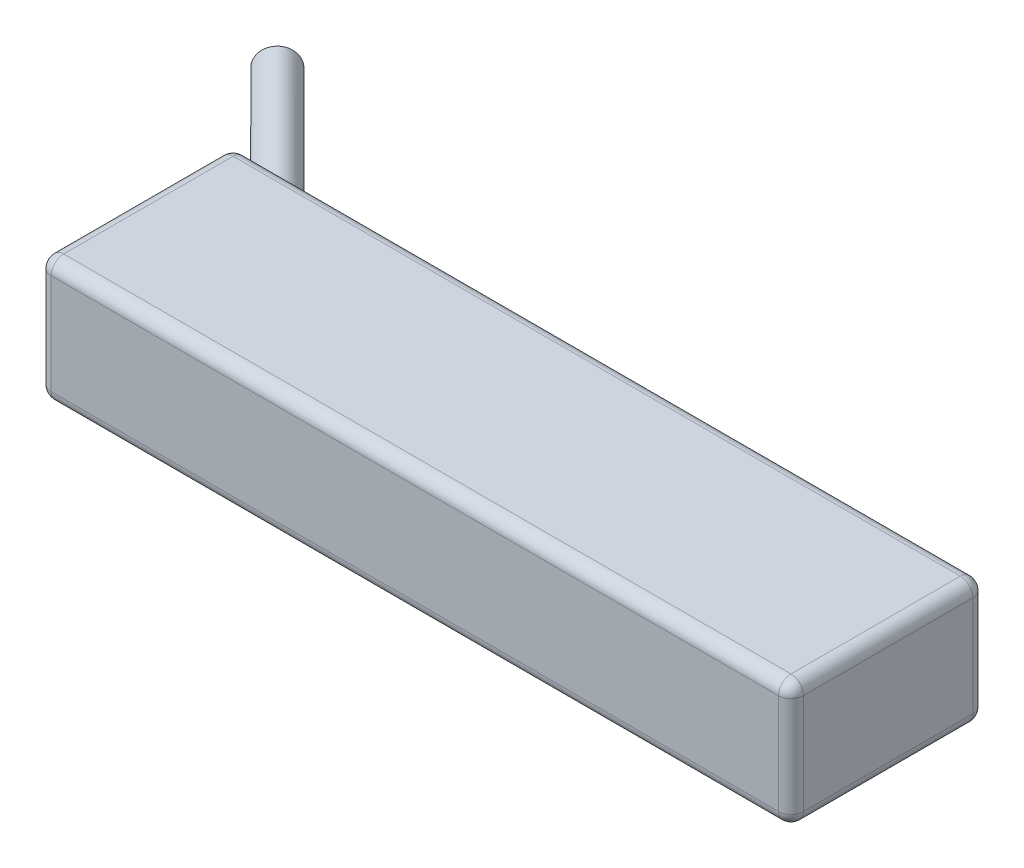
ISO-10303-21;
HEADER;
FILE_DESCRIPTION(('STEP AP214'),'2;1');
FILE_NAME('part.step','',(''),(''),'','','');
FILE_SCHEMA(('AUTOMOTIVE_DESIGN { 1 0 10303 214 1 1 1 1 }'));
ENDSEC;
DATA;
#1=APPLICATION_CONTEXT('core data for automotive mechanical design processes');
#2=APPLICATION_PROTOCOL_DEFINITION('international standard','automotive_design',2000,#1);
#3=PRODUCT_CONTEXT('',#1,'mechanical');
#4=PRODUCT('Part','Part','',(#3));
#5=PRODUCT_RELATED_PRODUCT_CATEGORY('part','',(#4));
#6=PRODUCT_DEFINITION_FORMATION('','',#4);
#7=PRODUCT_DEFINITION_CONTEXT('part definition',#1,'design');
#8=PRODUCT_DEFINITION('design','',#6,#7);
#9=PRODUCT_DEFINITION_SHAPE('','',#8);
#10=(LENGTH_UNIT() NAMED_UNIT(*) SI_UNIT(.MILLI.,.METRE.));
#11=(NAMED_UNIT(*) PLANE_ANGLE_UNIT() SI_UNIT($,.RADIAN.));
#12=(NAMED_UNIT(*) SI_UNIT($,.STERADIAN.) SOLID_ANGLE_UNIT());
#13=UNCERTAINTY_MEASURE_WITH_UNIT(LENGTH_MEASURE(1.E-05),#10,'distance_accuracy_value','');
#14=(GEOMETRIC_REPRESENTATION_CONTEXT(3) GLOBAL_UNCERTAINTY_ASSIGNED_CONTEXT((#13)) GLOBAL_UNIT_ASSIGNED_CONTEXT((#10,
#11,#12)) REPRESENTATION_CONTEXT('',''));
#15=CARTESIAN_POINT('',(0.,0.,0.));
#16=DIRECTION('',(0.,0.,1.));
#17=DIRECTION('',(1.,0.,0.));
#18=AXIS2_PLACEMENT_3D('',#15,#16,#17);
#19=CARTESIAN_POINT('',(60.,10.,-15.5));
#20=DIRECTION('',(-1.,0.,0.));
#21=DIRECTION('',(0.,0.,1.));
#22=AXIS2_PLACEMENT_3D('',#19,#20,#21);
#23=PLANE('',#22);
#24=DIRECTION('',(0.,-1.,0.));
#25=VECTOR('',#24,1.);
#26=CARTESIAN_POINT('',(60.,10.,13.5));
#27=LINE('',#26,#25);
#28=CARTESIAN_POINT('',(60.,8.,13.5));
#29=VERTEX_POINT('',#28);
#30=CARTESIAN_POINT('',(60.,-8.,13.5));
#31=VERTEX_POINT('',#30);
#32=EDGE_CURVE('E167',#29,#31,#27,.T.);
#33=ORIENTED_EDGE('',*,*,#32,.T.);
#34=DIRECTION('',(0.,0.,-1.));
#35=VECTOR('',#34,1.);
#36=CARTESIAN_POINT('',(60.,-8.,-15.5));
#37=LINE('',#36,#35);
#38=CARTESIAN_POINT('',(60.,-8.,-13.5));
#39=VERTEX_POINT('',#38);
#40=EDGE_CURVE('E172',#31,#39,#37,.T.);
#41=ORIENTED_EDGE('',*,*,#40,.T.);
#42=DIRECTION('',(0.,-1.,0.));
#43=VECTOR('',#42,1.);
#44=CARTESIAN_POINT('',(60.,10.,-13.5));
#45=LINE('',#44,#43);
#46=CARTESIAN_POINT('',(60.,8.,-13.5));
#47=VERTEX_POINT('',#46);
#48=EDGE_CURVE('E169',#39,#47,#45,.F.);
#49=ORIENTED_EDGE('',*,*,#48,.T.);
#50=DIRECTION('',(0.,0.,-1.));
#51=VECTOR('',#50,1.);
#52=CARTESIAN_POINT('',(60.,8.,15.5));
#53=LINE('',#52,#51);
#54=EDGE_CURVE('E165',#47,#29,#53,.F.);
#55=ORIENTED_EDGE('',*,*,#54,.T.);
#56=EDGE_LOOP('',(#33,#41,#49,#55));
#57=FACE_BOUND('',#56,.T.);
#58=ADVANCED_FACE('F38',(#57),#23,.F.);
#59=CARTESIAN_POINT('',(-60.,10.,-15.5));
#60=DIRECTION('',(0.,0.,1.));
#61=DIRECTION('',(1.,0.,0.));
#62=AXIS2_PLACEMENT_3D('',#59,#60,#61);
#63=PLANE('',#62);
#64=DIRECTION('',(0.,-1.,0.));
#65=VECTOR('',#64,1.);
#66=CARTESIAN_POINT('',(58.,10.,-15.5));
#67=LINE('',#66,#65);
#68=CARTESIAN_POINT('',(58.,8.,-15.5));
#69=VERTEX_POINT('',#68);
#70=CARTESIAN_POINT('',(58.,-8.,-15.5));
#71=VERTEX_POINT('',#70);
#72=EDGE_CURVE('E160',#69,#71,#67,.T.);
#73=ORIENTED_EDGE('',*,*,#72,.T.);
#74=DIRECTION('',(-1.,0.,0.));
#75=VECTOR('',#74,1.);
#76=CARTESIAN_POINT('',(-60.,-8.,-15.5));
#77=LINE('',#76,#75);
#78=CARTESIAN_POINT('',(-58.,-8.,-15.5));
#79=VERTEX_POINT('',#78);
#80=EDGE_CURVE('E163',#71,#79,#77,.T.);
#81=ORIENTED_EDGE('',*,*,#80,.T.);
#82=DIRECTION('',(0.,-1.,0.));
#83=VECTOR('',#82,1.);
#84=CARTESIAN_POINT('',(-58.,10.,-15.5));
#85=LINE('',#84,#83);
#86=CARTESIAN_POINT('',(-58.,8.,-15.5));
#87=VERTEX_POINT('',#86);
#88=EDGE_CURVE('E155',#79,#87,#85,.F.);
#89=ORIENTED_EDGE('',*,*,#88,.T.);
#90=DIRECTION('',(-1.,0.,0.));
#91=VECTOR('',#90,1.);
#92=CARTESIAN_POINT('',(60.,8.,-15.5));
#93=LINE('',#92,#91);
#94=EDGE_CURVE('E153',#87,#69,#93,.F.);
#95=ORIENTED_EDGE('',*,*,#94,.T.);
#96=EDGE_LOOP('',(#73,#81,#89,#95));
#97=FACE_BOUND('',#96,.T.);
#98=DIRECTION('',(0.,1.,0.));
#99=VECTOR('',#98,1.);
#100=CARTESIAN_POINT('',(-49.9999999999998,10.,-15.5));
#101=LINE('',#100,#99);
#102=CARTESIAN_POINT('',(-49.9999999999998,-6.17040966608935,-15.5));
#103=VERTEX_POINT('',#102);
#104=CARTESIAN_POINT('',(-49.9999999999998,-1.82959033391066,-15.5));
#105=VERTEX_POINT('',#104);
#106=EDGE_CURVE('E137',#103,#105,#101,.T.);
#107=ORIENTED_EDGE('',*,*,#106,.T.);
#108=CARTESIAN_POINT('',(-52.9289321881345,-4.,-15.5));
#109=DIRECTION('',(0.,0.,1.));
#110=DIRECTION('',(1.,0.,0.));
#111=AXIS2_PLACEMENT_3D('',#108,#109,#110);
#112=ELLIPSE('',#111,4.24264068711926,3.);
#113=EDGE_CURVE('E144',#105,#103,#112,.T.);
#114=ORIENTED_EDGE('',*,*,#113,.T.);
#115=EDGE_LOOP('',(#107,#114));
#116=FACE_BOUND('',#115,.T.);
#117=DIRECTION('',(0.,1.,0.));
#118=VECTOR('',#117,1.);
#119=CARTESIAN_POINT('',(-49.9999999999998,10.,-15.5));
#120=LINE('',#119,#118);
#121=CARTESIAN_POINT('',(-49.9999999999998,1.82959033391064,-15.5));
#122=VERTEX_POINT('',#121);
#123=CARTESIAN_POINT('',(-49.9999999999998,6.17040966608935,-15.5));
#124=VERTEX_POINT('',#123);
#125=EDGE_CURVE('E629',#122,#124,#120,.T.);
#126=ORIENTED_EDGE('',*,*,#125,.T.);
#127=CARTESIAN_POINT('',(-52.9289321881345,4.,-15.5));
#128=DIRECTION('',(0.,0.,1.));
#129=DIRECTION('',(1.,0.,0.));
#130=AXIS2_PLACEMENT_3D('',#127,#128,#129);
#131=ELLIPSE('',#130,4.24264068711927,3.);
#132=EDGE_CURVE('E145',#124,#122,#131,.T.);
#133=ORIENTED_EDGE('',*,*,#132,.T.);
#134=EDGE_LOOP('',(#126,#133));
#135=FACE_BOUND('',#134,.T.);
#136=ADVANCED_FACE('F151',(#97,#116,#135),#63,.F.);
#137=CARTESIAN_POINT('',(-60.,10.,-15.5));
#138=DIRECTION('',(1.,0.,0.));
#139=DIRECTION('',(0.,0.,-1.));
#140=AXIS2_PLACEMENT_3D('',#137,#138,#139);
#141=PLANE('',#140);
#142=DIRECTION('',(0.,-1.,0.));
#143=VECTOR('',#142,1.);
#144=CARTESIAN_POINT('',(-60.,10.,-13.5));
#145=LINE('',#144,#143);
#146=CARTESIAN_POINT('',(-60.,8.,-13.5));
#147=VERTEX_POINT('',#146);
#148=CARTESIAN_POINT('',(-60.,-8.,-13.5));
#149=VERTEX_POINT('',#148);
#150=EDGE_CURVE('E178',#147,#149,#145,.T.);
#151=ORIENTED_EDGE('',*,*,#150,.T.);
#152=DIRECTION('',(0.,0.,1.));
#153=VECTOR('',#152,1.);
#154=CARTESIAN_POINT('',(-60.,-8.,-15.5));
#155=LINE('',#154,#153);
#156=CARTESIAN_POINT('',(-60.,-8.,13.5));
#157=VERTEX_POINT('',#156);
#158=EDGE_CURVE('E181',#149,#157,#155,.T.);
#159=ORIENTED_EDGE('',*,*,#158,.T.);
#160=DIRECTION('',(0.,-1.,0.));
#161=VECTOR('',#160,1.);
#162=CARTESIAN_POINT('',(-60.,10.,13.5));
#163=LINE('',#162,#161);
#164=CARTESIAN_POINT('',(-60.,8.,13.5));
#165=VERTEX_POINT('',#164);
#166=EDGE_CURVE('E176',#157,#165,#163,.F.);
#167=ORIENTED_EDGE('',*,*,#166,.T.);
#168=DIRECTION('',(0.,0.,1.));
#169=VECTOR('',#168,1.);
#170=CARTESIAN_POINT('',(-60.,8.,-15.5));
#171=LINE('',#170,#169);
#172=EDGE_CURVE('E174',#165,#147,#171,.F.);
#173=ORIENTED_EDGE('',*,*,#172,.T.);
#174=EDGE_LOOP('',(#151,#159,#167,#173));
#175=FACE_BOUND('',#174,.T.);
#176=ADVANCED_FACE('F320',(#175),#141,.F.);
#177=CARTESIAN_POINT('',(-60.,10.,15.5));
#178=DIRECTION('',(0.,0.,-1.));
#179=DIRECTION('',(-1.,0.,0.));
#180=AXIS2_PLACEMENT_3D('',#177,#178,#179);
#181=PLANE('',#180);
#182=DIRECTION('',(0.,-1.,0.));
#183=VECTOR('',#182,1.);
#184=CARTESIAN_POINT('',(-58.,10.,15.5));
#185=LINE('',#184,#183);
#186=CARTESIAN_POINT('',(-58.,8.,15.5));
#187=VERTEX_POINT('',#186);
#188=CARTESIAN_POINT('',(-58.,-8.,15.5));
#189=VERTEX_POINT('',#188);
#190=EDGE_CURVE('E187',#187,#189,#185,.T.);
#191=ORIENTED_EDGE('',*,*,#190,.T.);
#192=DIRECTION('',(1.,0.,0.));
#193=VECTOR('',#192,1.);
#194=CARTESIAN_POINT('',(-60.,-8.,15.5));
#195=LINE('',#194,#193);
#196=CARTESIAN_POINT('',(58.,-8.,15.5));
#197=VERTEX_POINT('',#196);
#198=EDGE_CURVE('E190',#189,#197,#195,.T.);
#199=ORIENTED_EDGE('',*,*,#198,.T.);
#200=DIRECTION('',(0.,-1.,0.));
#201=VECTOR('',#200,1.);
#202=CARTESIAN_POINT('',(58.,10.,15.5));
#203=LINE('',#202,#201);
#204=CARTESIAN_POINT('',(58.,8.,15.5));
#205=VERTEX_POINT('',#204);
#206=EDGE_CURVE('E185',#197,#205,#203,.F.);
#207=ORIENTED_EDGE('',*,*,#206,.T.);
#208=DIRECTION('',(1.,0.,0.));
#209=VECTOR('',#208,1.);
#210=CARTESIAN_POINT('',(-60.,8.,15.5));
#211=LINE('',#210,#209);
#212=EDGE_CURVE('E183',#205,#187,#211,.F.);
#213=ORIENTED_EDGE('',*,*,#212,.T.);
#214=EDGE_LOOP('',(#191,#199,#207,#213));
#215=FACE_BOUND('',#214,.T.);
#216=ADVANCED_FACE('F323',(#215),#181,.F.);
#217=CARTESIAN_POINT('',(0.,10.,0.));
#218=DIRECTION('',(0.,1.,0.));
#219=DIRECTION('',(0.,0.,1.));
#220=AXIS2_PLACEMENT_3D('',#217,#218,#219);
#221=PLANE('',#220);
#222=DIRECTION('',(0.,0.,1.));
#223=VECTOR('',#222,1.);
#224=CARTESIAN_POINT('',(-58.,10.,15.5));
#225=LINE('',#224,#223);
#226=CARTESIAN_POINT('',(-58.,10.,-13.5));
#227=VERTEX_POINT('',#226);
#228=CARTESIAN_POINT('',(-58.,10.,13.5));
#229=VERTEX_POINT('',#228);
#230=EDGE_CURVE('E47',#227,#229,#225,.T.);
#231=ORIENTED_EDGE('',*,*,#230,.T.);
#232=DIRECTION('',(1.,0.,0.));
#233=VECTOR('',#232,1.);
#234=CARTESIAN_POINT('',(60.,10.,13.5));
#235=LINE('',#234,#233);
#236=CARTESIAN_POINT('',(58.,10.,13.5));
#237=VERTEX_POINT('',#236);
#238=EDGE_CURVE('E11',#229,#237,#235,.T.);
#239=ORIENTED_EDGE('',*,*,#238,.T.);
#240=DIRECTION('',(0.,0.,-1.));
#241=VECTOR('',#240,1.);
#242=CARTESIAN_POINT('',(58.,10.,-15.5));
#243=LINE('',#242,#241);
#244=CARTESIAN_POINT('',(58.,10.,-13.5));
#245=VERTEX_POINT('',#244);
#246=EDGE_CURVE('E201',#237,#245,#243,.T.);
#247=ORIENTED_EDGE('',*,*,#246,.T.);
#248=DIRECTION('',(-1.,0.,0.));
#249=VECTOR('',#248,1.);
#250=CARTESIAN_POINT('',(-60.,10.,-13.5));
#251=LINE('',#250,#249);
#252=EDGE_CURVE('E58',#245,#227,#251,.T.);
#253=ORIENTED_EDGE('',*,*,#252,.T.);
#254=EDGE_LOOP('',(#231,#239,#247,#253));
#255=FACE_BOUND('',#254,.T.);
#256=ADVANCED_FACE('F287',(#255),#221,.T.);
#257=CARTESIAN_POINT('',(0.,-10.,0.));
#258=DIRECTION('',(0.,1.,0.));
#259=DIRECTION('',(0.,0.,1.));
#260=AXIS2_PLACEMENT_3D('',#257,#258,#259);
#261=PLANE('',#260);
#262=DIRECTION('',(0.,0.,1.));
#263=VECTOR('',#262,1.);
#264=CARTESIAN_POINT('',(-58.,-10.,0.));
#265=LINE('',#264,#263);
#266=CARTESIAN_POINT('',(-58.,-10.,13.5));
#267=VERTEX_POINT('',#266);
#268=CARTESIAN_POINT('',(-58.,-10.,-13.5));
#269=VERTEX_POINT('',#268);
#270=EDGE_CURVE('E196',#267,#269,#265,.F.);
#271=ORIENTED_EDGE('',*,*,#270,.T.);
#272=DIRECTION('',(-1.,0.,0.));
#273=VECTOR('',#272,1.);
#274=CARTESIAN_POINT('',(0.,-10.,-13.5));
#275=LINE('',#274,#273);
#276=CARTESIAN_POINT('',(58.,-10.,-13.5));
#277=VERTEX_POINT('',#276);
#278=EDGE_CURVE('E198',#269,#277,#275,.F.);
#279=ORIENTED_EDGE('',*,*,#278,.T.);
#280=DIRECTION('',(0.,0.,-1.));
#281=VECTOR('',#280,1.);
#282=CARTESIAN_POINT('',(58.,-10.,0.));
#283=LINE('',#282,#281);
#284=CARTESIAN_POINT('',(58.,-10.,13.5));
#285=VERTEX_POINT('',#284);
#286=EDGE_CURVE('E192',#277,#285,#283,.F.);
#287=ORIENTED_EDGE('',*,*,#286,.T.);
#288=DIRECTION('',(1.,0.,0.));
#289=VECTOR('',#288,1.);
#290=CARTESIAN_POINT('',(0.,-10.,13.5));
#291=LINE('',#290,#289);
#292=EDGE_CURVE('E194',#285,#267,#291,.F.);
#293=ORIENTED_EDGE('',*,*,#292,.T.);
#294=EDGE_LOOP('',(#271,#279,#287,#293));
#295=FACE_BOUND('',#294,.T.);
#296=ADVANCED_FACE('F567',(#295),#261,.F.);
#297=CARTESIAN_POINT('',(-72.6776695296635,4.,-35.2487373415292));
#298=DIRECTION('',(0.707106781186544,0.,0.707106781186551));
#299=DIRECTION('',(0.707106781186551,0.,-0.707106781186544));
#300=AXIS2_PLACEMENT_3D('',#297,#298,#299);
#301=CYLINDRICAL_SURFACE('',#300,3.);
#302=CARTESIAN_POINT('',(-72.6776695296635,4.,-35.2487373415292));
#303=DIRECTION('',(0.707106781186544,0.,0.707106781186551));
#304=DIRECTION('',(0.707106781186551,0.,-0.707106781186544));
#305=AXIS2_PLACEMENT_3D('',#302,#303,#304);
#306=CIRCLE('',#305,3.);
#307=CARTESIAN_POINT('',(-70.5563491861039,4.,-37.3700576850888));
#308=VERTEX_POINT('',#307);
#309=EDGE_CURVE('E623',#308,#308,#306,.T.);
#310=ORIENTED_EDGE('',*,*,#309,.T.);
#311=EDGE_LOOP('',(#310));
#312=FACE_BOUND('',#311,.T.);
#313=ORIENTED_EDGE('',*,*,#132,.F.);
#314=CARTESIAN_POINT('',(-51.4644660940672,4.,-14.0355339059326));
#315=DIRECTION('',(0.707106781186544,0.,0.707106781186551));
#316=DIRECTION('',(0.707106781186551,0.,-0.707106781186544));
#317=AXIS2_PLACEMENT_3D('',#314,#315,#316);
#318=CIRCLE('',#317,3.);
#319=EDGE_CURVE('E628',#122,#124,#318,.T.);
#320=ORIENTED_EDGE('',*,*,#319,.F.);
#321=EDGE_LOOP('',(#313,#320));
#322=FACE_BOUND('',#321,.T.);
#323=ADVANCED_FACE('F558',(#312,#322),#301,.T.);
#324=CARTESIAN_POINT('',(-51.4644660940672,4.,-14.0355339059326));
#325=DIRECTION('',(0.707106781186544,0.,0.707106781186551));
#326=DIRECTION('',(0.707106781186551,0.,-0.707106781186544));
#327=AXIS2_PLACEMENT_3D('',#324,#325,#326);
#328=PLANE('',#327);
#329=ORIENTED_EDGE('',*,*,#125,.F.);
#330=ORIENTED_EDGE('',*,*,#319,.T.);
#331=EDGE_LOOP('',(#329,#330));
#332=FACE_BOUND('',#331,.T.);
#333=ADVANCED_FACE('F549',(#332),#328,.T.);
#334=CARTESIAN_POINT('',(-72.6776695296635,4.,-35.2487373415292));
#335=DIRECTION('',(0.707106781186544,0.,0.707106781186551));
#336=DIRECTION('',(0.707106781186551,0.,-0.707106781186544));
#337=AXIS2_PLACEMENT_3D('',#334,#335,#336);
#338=PLANE('',#337);
#339=ORIENTED_EDGE('',*,*,#309,.F.);
#340=EDGE_LOOP('',(#339));
#341=FACE_BOUND('',#340,.T.);
#342=ADVANCED_FACE('F540',(#341),#338,.F.);
#343=CARTESIAN_POINT('',(-72.6776695296635,-4.,-35.2487373415292));
#344=DIRECTION('',(0.707106781186544,0.,0.707106781186551));
#345=DIRECTION('',(0.707106781186551,0.,-0.707106781186544));
#346=AXIS2_PLACEMENT_3D('',#343,#344,#345);
#347=CYLINDRICAL_SURFACE('',#346,3.);
#348=CARTESIAN_POINT('',(-72.6776695296635,-4.,-35.2487373415292));
#349=DIRECTION('',(0.707106781186544,0.,0.707106781186551));
#350=DIRECTION('',(0.707106781186551,0.,-0.707106781186544));
#351=AXIS2_PLACEMENT_3D('',#348,#349,#350);
#352=CIRCLE('',#351,3.);
#353=CARTESIAN_POINT('',(-70.5563491861039,-4.,-37.3700576850888));
#354=VERTEX_POINT('',#353);
#355=EDGE_CURVE('E149',#354,#354,#352,.T.);
#356=ORIENTED_EDGE('',*,*,#355,.T.);
#357=EDGE_LOOP('',(#356));
#358=FACE_BOUND('',#357,.T.);
#359=ORIENTED_EDGE('',*,*,#113,.F.);
#360=CARTESIAN_POINT('',(-51.4644660940672,-4.,-14.0355339059326));
#361=DIRECTION('',(0.707106781186544,0.,0.707106781186551));
#362=DIRECTION('',(0.707106781186551,0.,-0.707106781186544));
#363=AXIS2_PLACEMENT_3D('',#360,#361,#362);
#364=CIRCLE('',#363,3.);
#365=EDGE_CURVE('E140',#103,#105,#364,.T.);
#366=ORIENTED_EDGE('',*,*,#365,.F.);
#367=EDGE_LOOP('',(#359,#366));
#368=FACE_BOUND('',#367,.T.);
#369=ADVANCED_FACE('F148',(#358,#368),#347,.T.);
#370=CARTESIAN_POINT('',(-51.4644660940672,-4.,-14.0355339059326));
#371=DIRECTION('',(0.707106781186544,0.,0.707106781186551));
#372=DIRECTION('',(0.707106781186551,0.,-0.707106781186544));
#373=AXIS2_PLACEMENT_3D('',#370,#371,#372);
#374=PLANE('',#373);
#375=ORIENTED_EDGE('',*,*,#106,.F.);
#376=ORIENTED_EDGE('',*,*,#365,.T.);
#377=EDGE_LOOP('',(#375,#376));
#378=FACE_BOUND('',#377,.T.);
#379=ADVANCED_FACE('F139',(#378),#374,.T.);
#380=CARTESIAN_POINT('',(-72.6776695296635,-4.,-35.2487373415292));
#381=DIRECTION('',(0.707106781186544,0.,0.707106781186551));
#382=DIRECTION('',(0.707106781186551,0.,-0.707106781186544));
#383=AXIS2_PLACEMENT_3D('',#380,#381,#382);
#384=PLANE('',#383);
#385=ORIENTED_EDGE('',*,*,#355,.F.);
#386=EDGE_LOOP('',(#385));
#387=FACE_BOUND('',#386,.T.);
#388=ADVANCED_FACE('F517',(#387),#384,.F.);
#389=CARTESIAN_POINT('',(-58.,10.,13.5));
#390=DIRECTION('',(0.,-1.,0.));
#391=DIRECTION('',(0.,0.,-1.));
#392=AXIS2_PLACEMENT_3D('',#389,#390,#391);
#393=CYLINDRICAL_SURFACE('',#392,2.);
#394=CARTESIAN_POINT('',(-58.,8.,13.5));
#395=DIRECTION('',(0.,1.,0.));
#396=DIRECTION('',(0.,0.,1.));
#397=AXIS2_PLACEMENT_3D('',#394,#395,#396);
#398=CIRCLE('',#397,2.);
#399=EDGE_CURVE('E42',#165,#187,#398,.T.);
#400=ORIENTED_EDGE('',*,*,#399,.F.);
#401=ORIENTED_EDGE('',*,*,#166,.F.);
#402=CARTESIAN_POINT('',(-58.,-8.,13.5));
#403=DIRECTION('',(0.,-1.,0.));
#404=DIRECTION('',(0.,0.,-1.));
#405=AXIS2_PLACEMENT_3D('',#402,#403,#404);
#406=CIRCLE('',#405,2.);
#407=EDGE_CURVE('E265',#189,#157,#406,.T.);
#408=ORIENTED_EDGE('',*,*,#407,.F.);
#409=ORIENTED_EDGE('',*,*,#190,.F.);
#410=EDGE_LOOP('',(#400,#401,#408,#409));
#411=FACE_BOUND('',#410,.T.);
#412=ADVANCED_FACE('F40',(#411),#393,.T.);
#413=CARTESIAN_POINT('',(-58.,8.,13.5));
#414=DIRECTION('',(0.,0.,1.));
#415=DIRECTION('',(1.,0.,0.));
#416=AXIS2_PLACEMENT_3D('',#413,#414,#415);
#417=SPHERICAL_SURFACE('',#416,2.);
#418=CARTESIAN_POINT('',(-58.,8.,13.5));
#419=DIRECTION('',(0.,0.,1.));
#420=DIRECTION('',(1.,0.,0.));
#421=AXIS2_PLACEMENT_3D('',#418,#419,#420);
#422=CIRCLE('',#421,2.);
#423=EDGE_CURVE('E261',#165,#229,#422,.F.);
#424=ORIENTED_EDGE('',*,*,#423,.F.);
#425=ORIENTED_EDGE('',*,*,#399,.T.);
#426=CARTESIAN_POINT('',(-58.,8.,13.5));
#427=DIRECTION('',(-1.,0.,0.));
#428=DIRECTION('',(0.,0.,1.));
#429=AXIS2_PLACEMENT_3D('',#426,#427,#428);
#430=CIRCLE('',#429,2.);
#431=EDGE_CURVE('E263',#229,#187,#430,.F.);
#432=ORIENTED_EDGE('',*,*,#431,.F.);
#433=EDGE_LOOP('',(#424,#425,#432));
#434=FACE_BOUND('',#433,.T.);
#435=ADVANCED_FACE('F276',(#434),#417,.T.);
#436=CARTESIAN_POINT('',(-58.,-8.,13.5));
#437=DIRECTION('',(-1.,0.,0.));
#438=DIRECTION('',(0.,0.,1.));
#439=AXIS2_PLACEMENT_3D('',#436,#437,#438);
#440=SPHERICAL_SURFACE('',#439,2.);
#441=CARTESIAN_POINT('',(-58.,-8.,13.5));
#442=DIRECTION('',(-1.,0.,0.));
#443=DIRECTION('',(0.,0.,1.));
#444=AXIS2_PLACEMENT_3D('',#441,#442,#443);
#445=CIRCLE('',#444,2.);
#446=EDGE_CURVE('E255',#189,#267,#445,.F.);
#447=ORIENTED_EDGE('',*,*,#446,.F.);
#448=ORIENTED_EDGE('',*,*,#407,.T.);
#449=CARTESIAN_POINT('',(-58.,-8.,13.5));
#450=DIRECTION('',(0.,0.,1.));
#451=DIRECTION('',(1.,0.,0.));
#452=AXIS2_PLACEMENT_3D('',#449,#450,#451);
#453=CIRCLE('',#452,2.);
#454=EDGE_CURVE('E258',#267,#157,#453,.F.);
#455=ORIENTED_EDGE('',*,*,#454,.F.);
#456=EDGE_LOOP('',(#447,#448,#455));
#457=FACE_BOUND('',#456,.T.);
#458=ADVANCED_FACE('F391',(#457),#440,.T.);
#459=CARTESIAN_POINT('',(0.,8.,13.5));
#460=DIRECTION('',(-1.,0.,0.));
#461=DIRECTION('',(0.,0.,1.));
#462=AXIS2_PLACEMENT_3D('',#459,#460,#461);
#463=CYLINDRICAL_SURFACE('',#462,2.);
#464=ORIENTED_EDGE('',*,*,#431,.T.);
#465=ORIENTED_EDGE('',*,*,#212,.F.);
#466=CARTESIAN_POINT('',(58.,8.,13.5));
#467=DIRECTION('',(1.,0.,0.));
#468=DIRECTION('',(0.,0.,-1.));
#469=AXIS2_PLACEMENT_3D('',#466,#467,#468);
#470=CIRCLE('',#469,2.);
#471=EDGE_CURVE('E249',#237,#205,#470,.T.);
#472=ORIENTED_EDGE('',*,*,#471,.F.);
#473=ORIENTED_EDGE('',*,*,#238,.F.);
#474=EDGE_LOOP('',(#464,#465,#472,#473));
#475=FACE_BOUND('',#474,.T.);
#476=ADVANCED_FACE('F284',(#475),#463,.T.);
#477=CARTESIAN_POINT('',(-58.,8.,0.));
#478=DIRECTION('',(0.,0.,-1.));
#479=DIRECTION('',(-1.,0.,0.));
#480=AXIS2_PLACEMENT_3D('',#477,#478,#479);
#481=CYLINDRICAL_SURFACE('',#480,2.);
#482=ORIENTED_EDGE('',*,*,#423,.T.);
#483=ORIENTED_EDGE('',*,*,#230,.F.);
#484=CARTESIAN_POINT('',(-58.,8.,-13.5));
#485=DIRECTION('',(0.,0.,-1.));
#486=DIRECTION('',(-1.,0.,0.));
#487=AXIS2_PLACEMENT_3D('',#484,#485,#486);
#488=CIRCLE('',#487,2.);
#489=EDGE_CURVE('E246',#147,#227,#488,.T.);
#490=ORIENTED_EDGE('',*,*,#489,.F.);
#491=ORIENTED_EDGE('',*,*,#172,.F.);
#492=EDGE_LOOP('',(#482,#483,#490,#491));
#493=FACE_BOUND('',#492,.T.);
#494=ADVANCED_FACE('F318',(#493),#481,.T.);
#495=CARTESIAN_POINT('',(-58.,10.,-13.5));
#496=DIRECTION('',(0.,-1.,0.));
#497=DIRECTION('',(0.,0.,-1.));
#498=AXIS2_PLACEMENT_3D('',#495,#496,#497);
#499=CYLINDRICAL_SURFACE('',#498,2.);
#500=CARTESIAN_POINT('',(-58.,-8.,-13.5));
#501=DIRECTION('',(0.,-1.,0.));
#502=DIRECTION('',(0.,0.,-1.));
#503=AXIS2_PLACEMENT_3D('',#500,#501,#502);
#504=CIRCLE('',#503,2.);
#505=EDGE_CURVE('E240',#149,#79,#504,.T.);
#506=ORIENTED_EDGE('',*,*,#505,.F.);
#507=ORIENTED_EDGE('',*,*,#150,.F.);
#508=CARTESIAN_POINT('',(-58.,8.,-13.5));
#509=DIRECTION('',(0.,1.,0.));
#510=DIRECTION('',(0.,0.,1.));
#511=AXIS2_PLACEMENT_3D('',#508,#509,#510);
#512=CIRCLE('',#511,2.);
#513=EDGE_CURVE('E243',#87,#147,#512,.T.);
#514=ORIENTED_EDGE('',*,*,#513,.F.);
#515=ORIENTED_EDGE('',*,*,#88,.F.);
#516=EDGE_LOOP('',(#506,#507,#514,#515));
#517=FACE_BOUND('',#516,.T.);
#518=ADVANCED_FACE('F313',(#517),#499,.T.);
#519=CARTESIAN_POINT('',(-58.,-8.,-15.5));
#520=DIRECTION('',(0.,0.,1.));
#521=DIRECTION('',(1.,0.,0.));
#522=AXIS2_PLACEMENT_3D('',#519,#520,#521);
#523=CYLINDRICAL_SURFACE('',#522,2.);
#524=ORIENTED_EDGE('',*,*,#454,.T.);
#525=ORIENTED_EDGE('',*,*,#158,.F.);
#526=CARTESIAN_POINT('',(-58.,-8.,-13.5));
#527=DIRECTION('',(0.,0.,-1.));
#528=DIRECTION('',(-1.,0.,0.));
#529=AXIS2_PLACEMENT_3D('',#526,#527,#528);
#530=CIRCLE('',#529,2.);
#531=EDGE_CURVE('E238',#269,#149,#530,.T.);
#532=ORIENTED_EDGE('',*,*,#531,.F.);
#533=ORIENTED_EDGE('',*,*,#270,.F.);
#534=EDGE_LOOP('',(#524,#525,#532,#533));
#535=FACE_BOUND('',#534,.T.);
#536=ADVANCED_FACE('F390',(#535),#523,.T.);
#537=CARTESIAN_POINT('',(-60.,-8.,13.5));
#538=DIRECTION('',(1.,0.,0.));
#539=DIRECTION('',(0.,0.,-1.));
#540=AXIS2_PLACEMENT_3D('',#537,#538,#539);
#541=CYLINDRICAL_SURFACE('',#540,2.);
#542=ORIENTED_EDGE('',*,*,#446,.T.);
#543=ORIENTED_EDGE('',*,*,#292,.F.);
#544=CARTESIAN_POINT('',(58.,-8.,13.5));
#545=DIRECTION('',(1.,0.,0.));
#546=DIRECTION('',(0.,0.,-1.));
#547=AXIS2_PLACEMENT_3D('',#544,#545,#546);
#548=CIRCLE('',#547,2.);
#549=EDGE_CURVE('E235',#197,#285,#548,.T.);
#550=ORIENTED_EDGE('',*,*,#549,.F.);
#551=ORIENTED_EDGE('',*,*,#198,.F.);
#552=EDGE_LOOP('',(#542,#543,#550,#551));
#553=FACE_BOUND('',#552,.T.);
#554=ADVANCED_FACE('F333',(#553),#541,.T.);
#555=CARTESIAN_POINT('',(58.,10.,13.5));
#556=DIRECTION('',(0.,-1.,0.));
#557=DIRECTION('',(0.,0.,-1.));
#558=AXIS2_PLACEMENT_3D('',#555,#556,#557);
#559=CYLINDRICAL_SURFACE('',#558,2.);
#560=CARTESIAN_POINT('',(58.,8.,13.5));
#561=DIRECTION('',(0.,1.,0.));
#562=DIRECTION('',(0.,0.,1.));
#563=AXIS2_PLACEMENT_3D('',#560,#561,#562);
#564=CIRCLE('',#563,2.);
#565=EDGE_CURVE('E252',#205,#29,#564,.T.);
#566=ORIENTED_EDGE('',*,*,#565,.F.);
#567=ORIENTED_EDGE('',*,*,#206,.F.);
#568=CARTESIAN_POINT('',(58.,-8.,13.5));
#569=DIRECTION('',(0.,-1.,0.));
#570=DIRECTION('',(0.,0.,-1.));
#571=AXIS2_PLACEMENT_3D('',#568,#569,#570);
#572=CIRCLE('',#571,2.);
#573=EDGE_CURVE('E232',#31,#197,#572,.T.);
#574=ORIENTED_EDGE('',*,*,#573,.F.);
#575=ORIENTED_EDGE('',*,*,#32,.F.);
#576=EDGE_LOOP('',(#566,#567,#574,#575));
#577=FACE_BOUND('',#576,.T.);
#578=ADVANCED_FACE('F328',(#577),#559,.T.);
#579=CARTESIAN_POINT('',(58.,8.,13.5));
#580=DIRECTION('',(0.,0.,1.));
#581=DIRECTION('',(1.,0.,0.));
#582=AXIS2_PLACEMENT_3D('',#579,#580,#581);
#583=SPHERICAL_SURFACE('',#582,2.);
#584=ORIENTED_EDGE('',*,*,#471,.T.);
#585=ORIENTED_EDGE('',*,*,#565,.T.);
#586=CARTESIAN_POINT('',(58.,8.,13.5));
#587=DIRECTION('',(0.,0.,1.));
#588=DIRECTION('',(0.,-1.,0.));
#589=AXIS2_PLACEMENT_3D('',#586,#587,#588);
#590=CIRCLE('',#589,2.);
#591=EDGE_CURVE('E229',#237,#29,#590,.F.);
#592=ORIENTED_EDGE('',*,*,#591,.F.);
#593=EDGE_LOOP('',(#584,#585,#592));
#594=FACE_BOUND('',#593,.T.);
#595=ADVANCED_FACE('F343',(#594),#583,.T.);
#596=CARTESIAN_POINT('',(-58.,8.,-13.5));
#597=DIRECTION('',(-1.,0.,0.));
#598=DIRECTION('',(0.,0.,1.));
#599=AXIS2_PLACEMENT_3D('',#596,#597,#598);
#600=SPHERICAL_SURFACE('',#599,2.);
#601=ORIENTED_EDGE('',*,*,#513,.T.);
#602=ORIENTED_EDGE('',*,*,#489,.T.);
#603=CARTESIAN_POINT('',(-58.,8.,-13.5));
#604=DIRECTION('',(-1.,0.,0.));
#605=DIRECTION('',(0.,0.,1.));
#606=AXIS2_PLACEMENT_3D('',#603,#604,#605);
#607=CIRCLE('',#606,2.);
#608=EDGE_CURVE('E226',#87,#227,#607,.F.);
#609=ORIENTED_EDGE('',*,*,#608,.F.);
#610=EDGE_LOOP('',(#601,#602,#609));
#611=FACE_BOUND('',#610,.T.);
#612=ADVANCED_FACE('F316',(#611),#600,.T.);
#613=CARTESIAN_POINT('',(-58.,-8.,-13.5));
#614=DIRECTION('',(-1.,0.,0.));
#615=DIRECTION('',(0.,0.,1.));
#616=AXIS2_PLACEMENT_3D('',#613,#614,#615);
#617=SPHERICAL_SURFACE('',#616,2.);
#618=ORIENTED_EDGE('',*,*,#531,.T.);
#619=ORIENTED_EDGE('',*,*,#505,.T.);
#620=CARTESIAN_POINT('',(-58.,-8.,-13.5));
#621=DIRECTION('',(-1.,0.,0.));
#622=DIRECTION('',(0.,0.,1.));
#623=AXIS2_PLACEMENT_3D('',#620,#621,#622);
#624=CIRCLE('',#623,2.);
#625=EDGE_CURVE('E223',#269,#79,#624,.F.);
#626=ORIENTED_EDGE('',*,*,#625,.F.);
#627=EDGE_LOOP('',(#618,#619,#626));
#628=FACE_BOUND('',#627,.T.);
#629=ADVANCED_FACE('F350',(#628),#617,.T.);
#630=CARTESIAN_POINT('',(58.,-8.,13.5));
#631=DIRECTION('',(0.,0.,1.));
#632=DIRECTION('',(0.,-1.,0.));
#633=AXIS2_PLACEMENT_3D('',#630,#631,#632);
#634=SPHERICAL_SURFACE('',#633,2.);
#635=ORIENTED_EDGE('',*,*,#573,.T.);
#636=ORIENTED_EDGE('',*,*,#549,.T.);
#637=CARTESIAN_POINT('',(58.,-8.,13.5));
#638=DIRECTION('',(0.,0.,1.));
#639=DIRECTION('',(1.,0.,0.));
#640=AXIS2_PLACEMENT_3D('',#637,#638,#639);
#641=CIRCLE('',#640,2.);
#642=EDGE_CURVE('E220',#31,#285,#641,.F.);
#643=ORIENTED_EDGE('',*,*,#642,.F.);
#644=EDGE_LOOP('',(#635,#636,#643));
#645=FACE_BOUND('',#644,.T.);
#646=ADVANCED_FACE('F335',(#645),#634,.T.);
#647=CARTESIAN_POINT('',(58.,8.,0.));
#648=DIRECTION('',(0.,0.,1.));
#649=DIRECTION('',(1.,0.,0.));
#650=AXIS2_PLACEMENT_3D('',#647,#648,#649);
#651=CYLINDRICAL_SURFACE('',#650,2.);
#652=ORIENTED_EDGE('',*,*,#591,.T.);
#653=ORIENTED_EDGE('',*,*,#54,.F.);
#654=CARTESIAN_POINT('',(58.,8.,-13.5));
#655=DIRECTION('',(0.,0.,-1.));
#656=DIRECTION('',(-1.,0.,0.));
#657=AXIS2_PLACEMENT_3D('',#654,#655,#656);
#658=CIRCLE('',#657,2.);
#659=EDGE_CURVE('E217',#245,#47,#658,.T.);
#660=ORIENTED_EDGE('',*,*,#659,.F.);
#661=ORIENTED_EDGE('',*,*,#246,.F.);
#662=EDGE_LOOP('',(#652,#653,#660,#661));
#663=FACE_BOUND('',#662,.T.);
#664=ADVANCED_FACE('F298',(#663),#651,.T.);
#665=CARTESIAN_POINT('',(0.,8.,-13.5));
#666=DIRECTION('',(1.,0.,0.));
#667=DIRECTION('',(0.,0.,-1.));
#668=AXIS2_PLACEMENT_3D('',#665,#666,#667);
#669=CYLINDRICAL_SURFACE('',#668,2.);
#670=ORIENTED_EDGE('',*,*,#608,.T.);
#671=ORIENTED_EDGE('',*,*,#252,.F.);
#672=CARTESIAN_POINT('',(58.,8.,-13.5));
#673=DIRECTION('',(1.,0.,0.));
#674=DIRECTION('',(0.,1.,0.));
#675=AXIS2_PLACEMENT_3D('',#672,#673,#674);
#676=CIRCLE('',#675,2.);
#677=EDGE_CURVE('E214',#69,#245,#676,.T.);
#678=ORIENTED_EDGE('',*,*,#677,.F.);
#679=ORIENTED_EDGE('',*,*,#94,.F.);
#680=EDGE_LOOP('',(#670,#671,#678,#679));
#681=FACE_BOUND('',#680,.T.);
#682=ADVANCED_FACE('F293',(#681),#669,.T.);
#683=CARTESIAN_POINT('',(-60.,-8.,-13.5));
#684=DIRECTION('',(-1.,0.,0.));
#685=DIRECTION('',(0.,0.,1.));
#686=AXIS2_PLACEMENT_3D('',#683,#684,#685);
#687=CYLINDRICAL_SURFACE('',#686,2.);
#688=ORIENTED_EDGE('',*,*,#625,.T.);
#689=ORIENTED_EDGE('',*,*,#80,.F.);
#690=CARTESIAN_POINT('',(58.,-8.,-13.5));
#691=DIRECTION('',(1.,0.,0.));
#692=DIRECTION('',(0.,0.,-1.));
#693=AXIS2_PLACEMENT_3D('',#690,#691,#692);
#694=CIRCLE('',#693,2.);
#695=EDGE_CURVE('E211',#277,#71,#694,.T.);
#696=ORIENTED_EDGE('',*,*,#695,.F.);
#697=ORIENTED_EDGE('',*,*,#278,.F.);
#698=EDGE_LOOP('',(#688,#689,#696,#697));
#699=FACE_BOUND('',#698,.T.);
#700=ADVANCED_FACE('F371',(#699),#687,.T.);
#701=CARTESIAN_POINT('',(58.,-8.,-15.5));
#702=DIRECTION('',(0.,0.,-1.));
#703=DIRECTION('',(-1.,0.,0.));
#704=AXIS2_PLACEMENT_3D('',#701,#702,#703);
#705=CYLINDRICAL_SURFACE('',#704,2.);
#706=ORIENTED_EDGE('',*,*,#642,.T.);
#707=ORIENTED_EDGE('',*,*,#286,.F.);
#708=CARTESIAN_POINT('',(58.,-8.,-13.5));
#709=DIRECTION('',(0.,0.,-1.));
#710=DIRECTION('',(-1.,0.,0.));
#711=AXIS2_PLACEMENT_3D('',#708,#709,#710);
#712=CIRCLE('',#711,2.);
#713=EDGE_CURVE('E209',#39,#277,#712,.T.);
#714=ORIENTED_EDGE('',*,*,#713,.F.);
#715=ORIENTED_EDGE('',*,*,#40,.F.);
#716=EDGE_LOOP('',(#706,#707,#714,#715));
#717=FACE_BOUND('',#716,.T.);
#718=ADVANCED_FACE('F340',(#717),#705,.T.);
#719=CARTESIAN_POINT('',(58.,8.,-13.5));
#720=DIRECTION('',(0.,1.,0.));
#721=DIRECTION('',(-1.,0.,0.));
#722=AXIS2_PLACEMENT_3D('',#719,#720,#721);
#723=SPHERICAL_SURFACE('',#722,2.);
#724=ORIENTED_EDGE('',*,*,#677,.T.);
#725=ORIENTED_EDGE('',*,*,#659,.T.);
#726=CARTESIAN_POINT('',(58.,8.,-13.5));
#727=DIRECTION('',(0.,1.,0.));
#728=DIRECTION('',(0.,0.,1.));
#729=AXIS2_PLACEMENT_3D('',#726,#727,#728);
#730=CIRCLE('',#729,2.);
#731=EDGE_CURVE('E207',#69,#47,#730,.F.);
#732=ORIENTED_EDGE('',*,*,#731,.F.);
#733=EDGE_LOOP('',(#724,#725,#732));
#734=FACE_BOUND('',#733,.T.);
#735=ADVANCED_FACE('F300',(#734),#723,.T.);
#736=CARTESIAN_POINT('',(58.,-8.,-13.5));
#737=DIRECTION('',(0.,-1.,0.));
#738=DIRECTION('',(0.,0.,-1.));
#739=AXIS2_PLACEMENT_3D('',#736,#737,#738);
#740=SPHERICAL_SURFACE('',#739,2.);
#741=ORIENTED_EDGE('',*,*,#713,.T.);
#742=ORIENTED_EDGE('',*,*,#695,.T.);
#743=CARTESIAN_POINT('',(58.,-8.,-13.5));
#744=DIRECTION('',(0.,-1.,0.));
#745=DIRECTION('',(0.,0.,-1.));
#746=AXIS2_PLACEMENT_3D('',#743,#744,#745);
#747=CIRCLE('',#746,2.);
#748=EDGE_CURVE('E205',#39,#71,#747,.F.);
#749=ORIENTED_EDGE('',*,*,#748,.F.);
#750=EDGE_LOOP('',(#741,#742,#749));
#751=FACE_BOUND('',#750,.T.);
#752=ADVANCED_FACE('F363',(#751),#740,.T.);
#753=CARTESIAN_POINT('',(58.,10.,-13.5));
#754=DIRECTION('',(0.,-1.,0.));
#755=DIRECTION('',(0.,0.,-1.));
#756=AXIS2_PLACEMENT_3D('',#753,#754,#755);
#757=CYLINDRICAL_SURFACE('',#756,2.);
#758=ORIENTED_EDGE('',*,*,#731,.T.);
#759=ORIENTED_EDGE('',*,*,#48,.F.);
#760=ORIENTED_EDGE('',*,*,#748,.T.);
#761=ORIENTED_EDGE('',*,*,#72,.F.);
#762=EDGE_LOOP('',(#758,#759,#760,#761));
#763=FACE_BOUND('',#762,.T.);
#764=ADVANCED_FACE('F304',(#763),#757,.T.);
#765=CLOSED_SHELL('',(#58,#136,#176,#216,#256,#296,#323,#333,#342,#369,#379,#388,#412,#435,#458,
#476,#494,#518,#536,#554,#578,#595,#612,#629,#646,#664,#682,#700,#718,#735,#752,#764));
#766=MANIFOLD_SOLID_BREP('B2',#765);
#767=ADVANCED_BREP_SHAPE_REPRESENTATION('',(#18,#766),#14);
#768=SHAPE_DEFINITION_REPRESENTATION(#9,#767);
ENDSEC;
END-ISO-10303-21;
